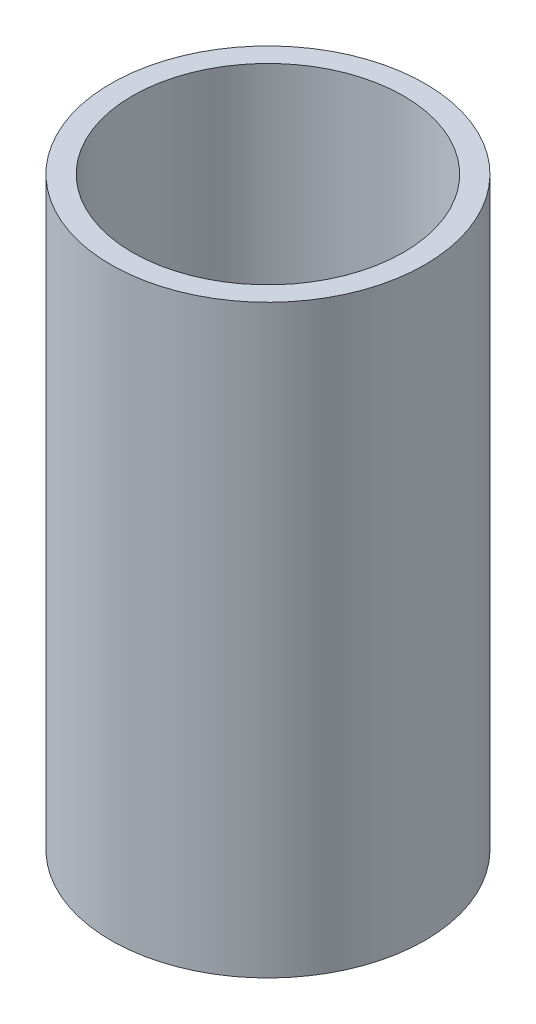
ISO-10303-21;
HEADER;
FILE_DESCRIPTION(('STEP AP214'),'2;1');
FILE_NAME('part.step','',(''),(''),'','','');
FILE_SCHEMA(('AUTOMOTIVE_DESIGN { 1 0 10303 214 1 1 1 1 }'));
ENDSEC;
DATA;
#1=APPLICATION_CONTEXT('core data for automotive mechanical design processes');
#2=APPLICATION_PROTOCOL_DEFINITION('international standard','automotive_design',2000,#1);
#3=PRODUCT_CONTEXT('',#1,'mechanical');
#4=PRODUCT('Part','Part','',(#3));
#5=PRODUCT_RELATED_PRODUCT_CATEGORY('part','',(#4));
#6=PRODUCT_DEFINITION_FORMATION('','',#4);
#7=PRODUCT_DEFINITION_CONTEXT('part definition',#1,'design');
#8=PRODUCT_DEFINITION('design','',#6,#7);
#9=PRODUCT_DEFINITION_SHAPE('','',#8);
#10=(LENGTH_UNIT() NAMED_UNIT(*) SI_UNIT(.MILLI.,.METRE.));
#11=(NAMED_UNIT(*) PLANE_ANGLE_UNIT() SI_UNIT($,.RADIAN.));
#12=(NAMED_UNIT(*) SI_UNIT($,.STERADIAN.) SOLID_ANGLE_UNIT());
#13=UNCERTAINTY_MEASURE_WITH_UNIT(LENGTH_MEASURE(1.E-05),#10,'distance_accuracy_value','');
#14=(GEOMETRIC_REPRESENTATION_CONTEXT(3) GLOBAL_UNCERTAINTY_ASSIGNED_CONTEXT((#13)) GLOBAL_UNIT_ASSIGNED_CONTEXT((#10,
#11,#12)) REPRESENTATION_CONTEXT('',''));
#15=CARTESIAN_POINT('',(0.,0.,0.));
#16=DIRECTION('',(0.,0.,1.));
#17=DIRECTION('',(1.,0.,0.));
#18=AXIS2_PLACEMENT_3D('',#15,#16,#17);
#19=CARTESIAN_POINT('',(0.,20.828,0.));
#20=DIRECTION('',(0.,-1.,0.));
#21=DIRECTION('',(0.,0.,-1.));
#22=AXIS2_PLACEMENT_3D('',#19,#20,#21);
#23=CYLINDRICAL_SURFACE('',#22,4.826);
#24=CARTESIAN_POINT('',(0.,20.828,0.));
#25=DIRECTION('',(0.,1.,0.));
#26=DIRECTION('',(1.,0.,0.));
#27=AXIS2_PLACEMENT_3D('',#24,#25,#26);
#28=CIRCLE('',#27,4.826);
#29=CARTESIAN_POINT('',(4.826,20.828,0.));
#30=VERTEX_POINT('',#29);
#31=EDGE_CURVE('E10',#30,#30,#28,.T.);
#32=ORIENTED_EDGE('',*,*,#31,.T.);
#33=EDGE_LOOP('',(#32));
#34=FACE_BOUND('',#33,.T.);
#35=CARTESIAN_POINT('',(0.,0.,0.));
#36=DIRECTION('',(0.,1.,0.));
#37=DIRECTION('',(1.,0.,0.));
#38=AXIS2_PLACEMENT_3D('',#35,#36,#37);
#39=CIRCLE('',#38,4.826);
#40=CARTESIAN_POINT('',(4.826,0.,0.));
#41=VERTEX_POINT('',#40);
#42=EDGE_CURVE('E28',#41,#41,#39,.T.);
#43=ORIENTED_EDGE('',*,*,#42,.F.);
#44=EDGE_LOOP('',(#43));
#45=FACE_BOUND('',#44,.T.);
#46=ADVANCED_FACE('F14',(#34,#45),#23,.F.);
#47=CARTESIAN_POINT('',(0.,20.828,0.));
#48=DIRECTION('',(0.,-1.,0.));
#49=DIRECTION('',(0.,0.,-1.));
#50=AXIS2_PLACEMENT_3D('',#47,#48,#49);
#51=CYLINDRICAL_SURFACE('',#50,5.588);
#52=CARTESIAN_POINT('',(0.,20.828,0.));
#53=DIRECTION('',(0.,1.,0.));
#54=DIRECTION('',(1.,0.,0.));
#55=AXIS2_PLACEMENT_3D('',#52,#53,#54);
#56=CIRCLE('',#55,5.588);
#57=CARTESIAN_POINT('',(5.588,20.828,0.));
#58=VERTEX_POINT('',#57);
#59=EDGE_CURVE('E26',#58,#58,#56,.T.);
#60=ORIENTED_EDGE('',*,*,#59,.F.);
#61=EDGE_LOOP('',(#60));
#62=FACE_BOUND('',#61,.T.);
#63=CARTESIAN_POINT('',(0.,0.,0.));
#64=DIRECTION('',(0.,1.,0.));
#65=DIRECTION('',(1.,0.,0.));
#66=AXIS2_PLACEMENT_3D('',#63,#64,#65);
#67=CIRCLE('',#66,5.588);
#68=CARTESIAN_POINT('',(5.588,0.,0.));
#69=VERTEX_POINT('',#68);
#70=EDGE_CURVE('E18',#69,#69,#67,.T.);
#71=ORIENTED_EDGE('',*,*,#70,.T.);
#72=EDGE_LOOP('',(#71));
#73=FACE_BOUND('',#72,.T.);
#74=ADVANCED_FACE('F16',(#62,#73),#51,.T.);
#75=CARTESIAN_POINT('',(0.,20.828,0.));
#76=DIRECTION('',(0.,1.,0.));
#77=DIRECTION('',(0.,0.,1.));
#78=AXIS2_PLACEMENT_3D('',#75,#76,#77);
#79=PLANE('',#78);
#80=ORIENTED_EDGE('',*,*,#59,.T.);
#81=EDGE_LOOP('',(#80));
#82=FACE_BOUND('',#81,.T.);
#83=ORIENTED_EDGE('',*,*,#31,.F.);
#84=EDGE_LOOP('',(#83));
#85=FACE_BOUND('',#84,.T.);
#86=ADVANCED_FACE('F33',(#82,#85),#79,.T.);
#87=CARTESIAN_POINT('',(0.,0.,0.));
#88=DIRECTION('',(0.,1.,0.));
#89=DIRECTION('',(0.,0.,1.));
#90=AXIS2_PLACEMENT_3D('',#87,#88,#89);
#91=PLANE('',#90);
#92=ORIENTED_EDGE('',*,*,#70,.F.);
#93=EDGE_LOOP('',(#92));
#94=FACE_BOUND('',#93,.T.);
#95=ORIENTED_EDGE('',*,*,#42,.T.);
#96=EDGE_LOOP('',(#95));
#97=FACE_BOUND('',#96,.T.);
#98=ADVANCED_FACE('F40',(#94,#97),#91,.F.);
#99=CLOSED_SHELL('',(#46,#74,#86,#98));
#100=MANIFOLD_SOLID_BREP('B1',#99);
#101=ADVANCED_BREP_SHAPE_REPRESENTATION('',(#18,#100),#14);
#102=SHAPE_DEFINITION_REPRESENTATION(#9,#101);
ENDSEC;
END-ISO-10303-21;
